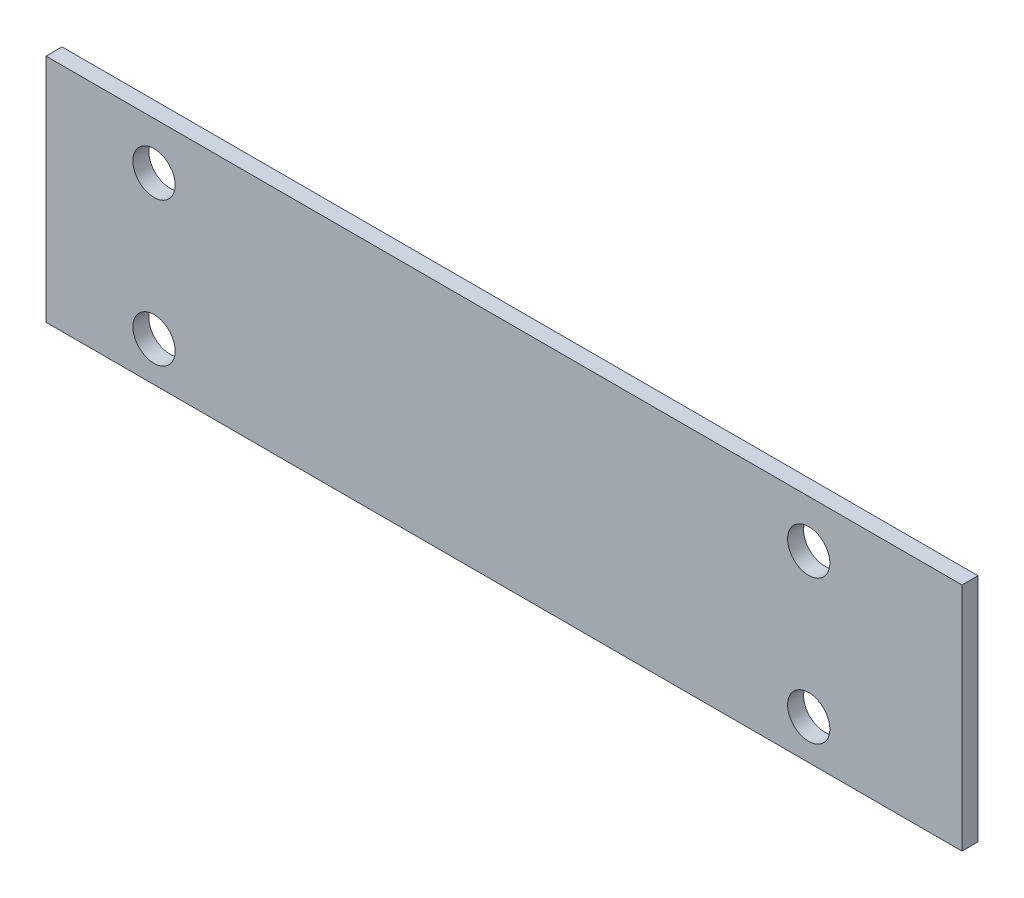
ISO-10303-21;
HEADER;
FILE_DESCRIPTION(('STEP AP214'),'2;1');
FILE_NAME('part.step','',(''),(''),'','','');
FILE_SCHEMA(('AUTOMOTIVE_DESIGN { 1 0 10303 214 1 1 1 1 }'));
ENDSEC;
DATA;
#1=APPLICATION_CONTEXT('core data for automotive mechanical design processes');
#2=APPLICATION_PROTOCOL_DEFINITION('international standard','automotive_design',2000,#1);
#3=PRODUCT_CONTEXT('',#1,'mechanical');
#4=PRODUCT('Part','Part','',(#3));
#5=PRODUCT_RELATED_PRODUCT_CATEGORY('part','',(#4));
#6=PRODUCT_DEFINITION_FORMATION('','',#4);
#7=PRODUCT_DEFINITION_CONTEXT('part definition',#1,'design');
#8=PRODUCT_DEFINITION('design','',#6,#7);
#9=PRODUCT_DEFINITION_SHAPE('','',#8);
#10=(LENGTH_UNIT() NAMED_UNIT(*) SI_UNIT(.MILLI.,.METRE.));
#11=(NAMED_UNIT(*) PLANE_ANGLE_UNIT() SI_UNIT($,.RADIAN.));
#12=(NAMED_UNIT(*) SI_UNIT($,.STERADIAN.) SOLID_ANGLE_UNIT());
#13=UNCERTAINTY_MEASURE_WITH_UNIT(LENGTH_MEASURE(1.E-05),#10,'distance_accuracy_value','');
#14=(GEOMETRIC_REPRESENTATION_CONTEXT(3) GLOBAL_UNCERTAINTY_ASSIGNED_CONTEXT((#13)) GLOBAL_UNIT_ASSIGNED_CONTEXT((#10,
#11,#12)) REPRESENTATION_CONTEXT('',''));
#15=CARTESIAN_POINT('',(0.,0.,0.));
#16=DIRECTION('',(0.,0.,1.));
#17=DIRECTION('',(1.,0.,0.));
#18=AXIS2_PLACEMENT_3D('',#15,#16,#17);
#19=CARTESIAN_POINT('',(-119.19,0.,1.04));
#20=DIRECTION('',(-1.,0.,0.));
#21=DIRECTION('',(0.,0.,1.));
#22=AXIS2_PLACEMENT_3D('',#19,#20,#21);
#23=PLANE('',#22);
#24=DIRECTION('',(0.,1.,0.));
#25=VECTOR('',#24,1.);
#26=CARTESIAN_POINT('',(-119.19,0.,-1.04));
#27=LINE('',#26,#25);
#28=CARTESIAN_POINT('',(-119.19,0.,-1.04));
#29=VERTEX_POINT('',#28);
#30=CARTESIAN_POINT('',(-119.19,30.,-1.04));
#31=VERTEX_POINT('',#30);
#32=EDGE_CURVE('E115',#29,#31,#27,.T.);
#33=ORIENTED_EDGE('',*,*,#32,.F.);
#34=DIRECTION('',(0.,0.,-1.));
#35=VECTOR('',#34,1.);
#36=CARTESIAN_POINT('',(-119.19,0.,1.04));
#37=LINE('',#36,#35);
#38=CARTESIAN_POINT('',(-119.19,0.,1.04));
#39=VERTEX_POINT('',#38);
#40=EDGE_CURVE('E11',#39,#29,#37,.T.);
#41=ORIENTED_EDGE('',*,*,#40,.F.);
#42=DIRECTION('',(0.,1.,0.));
#43=VECTOR('',#42,1.);
#44=CARTESIAN_POINT('',(-119.19,0.,1.04));
#45=LINE('',#44,#43);
#46=CARTESIAN_POINT('',(-119.19,30.,1.04));
#47=VERTEX_POINT('',#46);
#48=EDGE_CURVE('E96',#39,#47,#45,.T.);
#49=ORIENTED_EDGE('',*,*,#48,.T.);
#50=DIRECTION('',(0.,0.,-1.));
#51=VECTOR('',#50,1.);
#52=CARTESIAN_POINT('',(-119.19,30.,1.04));
#53=LINE('',#52,#51);
#54=EDGE_CURVE('E75',#47,#31,#53,.T.);
#55=ORIENTED_EDGE('',*,*,#54,.T.);
#56=EDGE_LOOP('',(#33,#41,#49,#55));
#57=FACE_BOUND('',#56,.T.);
#58=ADVANCED_FACE('F35',(#57),#23,.T.);
#59=CARTESIAN_POINT('',(0.,0.,1.04));
#60=DIRECTION('',(0.,-1.,0.));
#61=DIRECTION('',(1.,0.,0.));
#62=AXIS2_PLACEMENT_3D('',#59,#60,#61);
#63=PLANE('',#62);
#64=DIRECTION('',(-1.,0.,0.));
#65=VECTOR('',#64,1.);
#66=CARTESIAN_POINT('',(0.,0.,-1.04));
#67=LINE('',#66,#65);
#68=CARTESIAN_POINT('',(0.,0.,-1.04));
#69=VERTEX_POINT('',#68);
#70=EDGE_CURVE('E87',#69,#29,#67,.T.);
#71=ORIENTED_EDGE('',*,*,#70,.F.);
#72=DIRECTION('',(0.,0.,-1.));
#73=VECTOR('',#72,1.);
#74=CARTESIAN_POINT('',(0.,0.,1.04));
#75=LINE('',#74,#73);
#76=CARTESIAN_POINT('',(0.,0.,1.04));
#77=VERTEX_POINT('',#76);
#78=EDGE_CURVE('E44',#77,#69,#75,.T.);
#79=ORIENTED_EDGE('',*,*,#78,.F.);
#80=DIRECTION('',(-1.,0.,0.));
#81=VECTOR('',#80,1.);
#82=CARTESIAN_POINT('',(0.,0.,1.04));
#83=LINE('',#82,#81);
#84=EDGE_CURVE('E85',#77,#39,#83,.T.);
#85=ORIENTED_EDGE('',*,*,#84,.T.);
#86=ORIENTED_EDGE('',*,*,#40,.T.);
#87=EDGE_LOOP('',(#71,#79,#85,#86));
#88=FACE_BOUND('',#87,.T.);
#89=ADVANCED_FACE('F83',(#88),#63,.T.);
#90=CARTESIAN_POINT('',(0.,0.,1.04));
#91=DIRECTION('',(-1.,0.,0.));
#92=DIRECTION('',(0.,0.,1.));
#93=AXIS2_PLACEMENT_3D('',#90,#91,#92);
#94=PLANE('',#93);
#95=DIRECTION('',(0.,1.,0.));
#96=VECTOR('',#95,1.);
#97=CARTESIAN_POINT('',(0.,0.,-1.04));
#98=LINE('',#97,#96);
#99=CARTESIAN_POINT('',(0.,30.,-1.04));
#100=VERTEX_POINT('',#99);
#101=EDGE_CURVE('E118',#69,#100,#98,.T.);
#102=ORIENTED_EDGE('',*,*,#101,.T.);
#103=DIRECTION('',(0.,0.,-1.));
#104=VECTOR('',#103,1.);
#105=CARTESIAN_POINT('',(0.,30.,1.04));
#106=LINE('',#105,#104);
#107=CARTESIAN_POINT('',(0.,30.,1.04));
#108=VERTEX_POINT('',#107);
#109=EDGE_CURVE('E90',#108,#100,#106,.T.);
#110=ORIENTED_EDGE('',*,*,#109,.F.);
#111=DIRECTION('',(0.,1.,0.));
#112=VECTOR('',#111,1.);
#113=CARTESIAN_POINT('',(0.,0.,1.04));
#114=LINE('',#113,#112);
#115=EDGE_CURVE('E92',#77,#108,#114,.T.);
#116=ORIENTED_EDGE('',*,*,#115,.F.);
#117=ORIENTED_EDGE('',*,*,#78,.T.);
#118=EDGE_LOOP('',(#102,#110,#116,#117));
#119=FACE_BOUND('',#118,.T.);
#120=ADVANCED_FACE('F93',(#119),#94,.F.);
#121=CARTESIAN_POINT('',(-105.132851775486,23.85,1.04));
#122=DIRECTION('',(0.,0.,-1.));
#123=DIRECTION('',(-1.,0.,0.));
#124=AXIS2_PLACEMENT_3D('',#121,#122,#123);
#125=CYLINDRICAL_SURFACE('',#124,2.75000000000001);
#126=CARTESIAN_POINT('',(-105.132851775486,23.85,1.04));
#127=DIRECTION('',(0.,0.,1.));
#128=DIRECTION('',(1.,0.,0.));
#129=AXIS2_PLACEMENT_3D('',#126,#127,#128);
#130=CIRCLE('',#129,2.75000000000001);
#131=CARTESIAN_POINT('',(-102.382851775486,23.85,1.04));
#132=VERTEX_POINT('',#131);
#133=EDGE_CURVE('E98',#132,#132,#130,.T.);
#134=ORIENTED_EDGE('',*,*,#133,.T.);
#135=EDGE_LOOP('',(#134));
#136=FACE_BOUND('',#135,.T.);
#137=CARTESIAN_POINT('',(-105.132851775486,23.85,-1.04));
#138=DIRECTION('',(0.,0.,1.));
#139=DIRECTION('',(1.,0.,0.));
#140=AXIS2_PLACEMENT_3D('',#137,#138,#139);
#141=CIRCLE('',#140,2.75000000000001);
#142=CARTESIAN_POINT('',(-102.382851775486,23.85,-1.04));
#143=VERTEX_POINT('',#142);
#144=EDGE_CURVE('E112',#143,#143,#141,.T.);
#145=ORIENTED_EDGE('',*,*,#144,.F.);
#146=EDGE_LOOP('',(#145));
#147=FACE_BOUND('',#146,.T.);
#148=ADVANCED_FACE('F134',(#136,#147),#125,.F.);
#149=CARTESIAN_POINT('',(-105.132851775486,5.14999999999997,1.04));
#150=DIRECTION('',(0.,0.,-1.));
#151=DIRECTION('',(-1.,0.,0.));
#152=AXIS2_PLACEMENT_3D('',#149,#150,#151);
#153=CYLINDRICAL_SURFACE('',#152,2.75000000000001);
#154=CARTESIAN_POINT('',(-105.132851775486,5.14999999999997,1.04));
#155=DIRECTION('',(0.,0.,1.));
#156=DIRECTION('',(1.,0.,0.));
#157=AXIS2_PLACEMENT_3D('',#154,#155,#156);
#158=CIRCLE('',#157,2.75000000000001);
#159=CARTESIAN_POINT('',(-102.382851775486,5.14999999999997,1.04));
#160=VERTEX_POINT('',#159);
#161=EDGE_CURVE('E234',#160,#160,#158,.T.);
#162=ORIENTED_EDGE('',*,*,#161,.T.);
#163=EDGE_LOOP('',(#162));
#164=FACE_BOUND('',#163,.T.);
#165=CARTESIAN_POINT('',(-105.132851775486,5.14999999999997,-1.04));
#166=DIRECTION('',(0.,0.,1.));
#167=DIRECTION('',(1.,0.,0.));
#168=AXIS2_PLACEMENT_3D('',#165,#166,#167);
#169=CIRCLE('',#168,2.75000000000001);
#170=CARTESIAN_POINT('',(-102.382851775486,5.14999999999997,-1.04));
#171=VERTEX_POINT('',#170);
#172=EDGE_CURVE('E109',#171,#171,#169,.T.);
#173=ORIENTED_EDGE('',*,*,#172,.F.);
#174=EDGE_LOOP('',(#173));
#175=FACE_BOUND('',#174,.T.);
#176=ADVANCED_FACE('F137',(#164,#175),#153,.F.);
#177=CARTESIAN_POINT('',(-19.9467400729806,23.85,1.04));
#178=DIRECTION('',(0.,0.,-1.));
#179=DIRECTION('',(-1.,0.,0.));
#180=AXIS2_PLACEMENT_3D('',#177,#178,#179);
#181=CYLINDRICAL_SURFACE('',#180,2.75);
#182=CARTESIAN_POINT('',(-19.9467400729806,23.85,1.04));
#183=DIRECTION('',(0.,0.,1.));
#184=DIRECTION('',(1.,0.,0.));
#185=AXIS2_PLACEMENT_3D('',#182,#183,#184);
#186=CIRCLE('',#185,2.75);
#187=CARTESIAN_POINT('',(-17.1967400729806,23.85,1.04));
#188=VERTEX_POINT('',#187);
#189=EDGE_CURVE('E151',#188,#188,#186,.T.);
#190=ORIENTED_EDGE('',*,*,#189,.T.);
#191=EDGE_LOOP('',(#190));
#192=FACE_BOUND('',#191,.T.);
#193=CARTESIAN_POINT('',(-19.9467400729806,23.85,-1.04));
#194=DIRECTION('',(0.,0.,1.));
#195=DIRECTION('',(1.,0.,0.));
#196=AXIS2_PLACEMENT_3D('',#193,#194,#195);
#197=CIRCLE('',#196,2.75);
#198=CARTESIAN_POINT('',(-17.1967400729806,23.85,-1.04));
#199=VERTEX_POINT('',#198);
#200=EDGE_CURVE('E106',#199,#199,#197,.T.);
#201=ORIENTED_EDGE('',*,*,#200,.F.);
#202=EDGE_LOOP('',(#201));
#203=FACE_BOUND('',#202,.T.);
#204=ADVANCED_FACE('F140',(#192,#203),#181,.F.);
#205=CARTESIAN_POINT('',(-19.9467400729806,5.14999999999997,1.04));
#206=DIRECTION('',(0.,0.,-1.));
#207=DIRECTION('',(-1.,0.,0.));
#208=AXIS2_PLACEMENT_3D('',#205,#206,#207);
#209=CYLINDRICAL_SURFACE('',#208,2.75);
#210=CARTESIAN_POINT('',(-19.9467400729806,5.14999999999997,1.04));
#211=DIRECTION('',(0.,0.,1.));
#212=DIRECTION('',(1.,0.,0.));
#213=AXIS2_PLACEMENT_3D('',#210,#211,#212);
#214=CIRCLE('',#213,2.75);
#215=CARTESIAN_POINT('',(-17.1967400729806,5.14999999999997,1.04));
#216=VERTEX_POINT('',#215);
#217=EDGE_CURVE('E121',#216,#216,#214,.T.);
#218=ORIENTED_EDGE('',*,*,#217,.T.);
#219=EDGE_LOOP('',(#218));
#220=FACE_BOUND('',#219,.T.);
#221=CARTESIAN_POINT('',(-19.9467400729806,5.14999999999997,-1.04));
#222=DIRECTION('',(0.,0.,1.));
#223=DIRECTION('',(1.,0.,0.));
#224=AXIS2_PLACEMENT_3D('',#221,#222,#223);
#225=CIRCLE('',#224,2.75);
#226=CARTESIAN_POINT('',(-17.1967400729806,5.14999999999997,-1.04));
#227=VERTEX_POINT('',#226);
#228=EDGE_CURVE('E103',#227,#227,#225,.T.);
#229=ORIENTED_EDGE('',*,*,#228,.F.);
#230=EDGE_LOOP('',(#229));
#231=FACE_BOUND('',#230,.T.);
#232=ADVANCED_FACE('F37',(#220,#231),#209,.F.);
#233=CARTESIAN_POINT('',(0.,30.,1.04));
#234=DIRECTION('',(0.,-1.,0.));
#235=DIRECTION('',(1.,0.,0.));
#236=AXIS2_PLACEMENT_3D('',#233,#234,#235);
#237=PLANE('',#236);
#238=DIRECTION('',(-1.,0.,0.));
#239=VECTOR('',#238,1.);
#240=CARTESIAN_POINT('',(0.,30.,-1.04));
#241=LINE('',#240,#239);
#242=EDGE_CURVE('E68',#100,#31,#241,.T.);
#243=ORIENTED_EDGE('',*,*,#242,.T.);
#244=ORIENTED_EDGE('',*,*,#54,.F.);
#245=DIRECTION('',(-1.,0.,0.));
#246=VECTOR('',#245,1.);
#247=CARTESIAN_POINT('',(0.,30.,1.04));
#248=LINE('',#247,#246);
#249=EDGE_CURVE('E52',#108,#47,#248,.T.);
#250=ORIENTED_EDGE('',*,*,#249,.F.);
#251=ORIENTED_EDGE('',*,*,#109,.T.);
#252=EDGE_LOOP('',(#243,#244,#250,#251));
#253=FACE_BOUND('',#252,.T.);
#254=ADVANCED_FACE('F124',(#253),#237,.F.);
#255=CARTESIAN_POINT('',(0.,0.,1.04));
#256=DIRECTION('',(0.,0.,1.));
#257=DIRECTION('',(1.,0.,0.));
#258=AXIS2_PLACEMENT_3D('',#255,#256,#257);
#259=PLANE('',#258);
#260=ORIENTED_EDGE('',*,*,#217,.F.);
#261=EDGE_LOOP('',(#260));
#262=FACE_BOUND('',#261,.T.);
#263=ORIENTED_EDGE('',*,*,#189,.F.);
#264=EDGE_LOOP('',(#263));
#265=FACE_BOUND('',#264,.T.);
#266=ORIENTED_EDGE('',*,*,#161,.F.);
#267=EDGE_LOOP('',(#266));
#268=FACE_BOUND('',#267,.T.);
#269=ORIENTED_EDGE('',*,*,#133,.F.);
#270=EDGE_LOOP('',(#269));
#271=FACE_BOUND('',#270,.T.);
#272=ORIENTED_EDGE('',*,*,#48,.F.);
#273=ORIENTED_EDGE('',*,*,#84,.F.);
#274=ORIENTED_EDGE('',*,*,#115,.T.);
#275=ORIENTED_EDGE('',*,*,#249,.T.);
#276=EDGE_LOOP('',(#272,#273,#274,#275));
#277=FACE_BOUND('',#276,.T.);
#278=ADVANCED_FACE('F95',(#262,#265,#268,#271,#277),#259,.T.);
#279=CARTESIAN_POINT('',(0.,0.,-1.04));
#280=DIRECTION('',(0.,0.,1.));
#281=DIRECTION('',(1.,0.,0.));
#282=AXIS2_PLACEMENT_3D('',#279,#280,#281);
#283=PLANE('',#282);
#284=ORIENTED_EDGE('',*,*,#228,.T.);
#285=EDGE_LOOP('',(#284));
#286=FACE_BOUND('',#285,.T.);
#287=ORIENTED_EDGE('',*,*,#200,.T.);
#288=EDGE_LOOP('',(#287));
#289=FACE_BOUND('',#288,.T.);
#290=ORIENTED_EDGE('',*,*,#172,.T.);
#291=EDGE_LOOP('',(#290));
#292=FACE_BOUND('',#291,.T.);
#293=ORIENTED_EDGE('',*,*,#144,.T.);
#294=EDGE_LOOP('',(#293));
#295=FACE_BOUND('',#294,.T.);
#296=ORIENTED_EDGE('',*,*,#32,.T.);
#297=ORIENTED_EDGE('',*,*,#242,.F.);
#298=ORIENTED_EDGE('',*,*,#101,.F.);
#299=ORIENTED_EDGE('',*,*,#70,.T.);
#300=EDGE_LOOP('',(#296,#297,#298,#299));
#301=FACE_BOUND('',#300,.T.);
#302=ADVANCED_FACE('F125',(#286,#289,#292,#295,#301),#283,.F.);
#303=CLOSED_SHELL('',(#58,#89,#120,#148,#176,#204,#232,#254,#278,#302));
#304=MANIFOLD_SOLID_BREP('B2',#303);
#305=ADVANCED_BREP_SHAPE_REPRESENTATION('',(#18,#304),#14);
#306=SHAPE_DEFINITION_REPRESENTATION(#9,#305);
ENDSEC;
END-ISO-10303-21;
